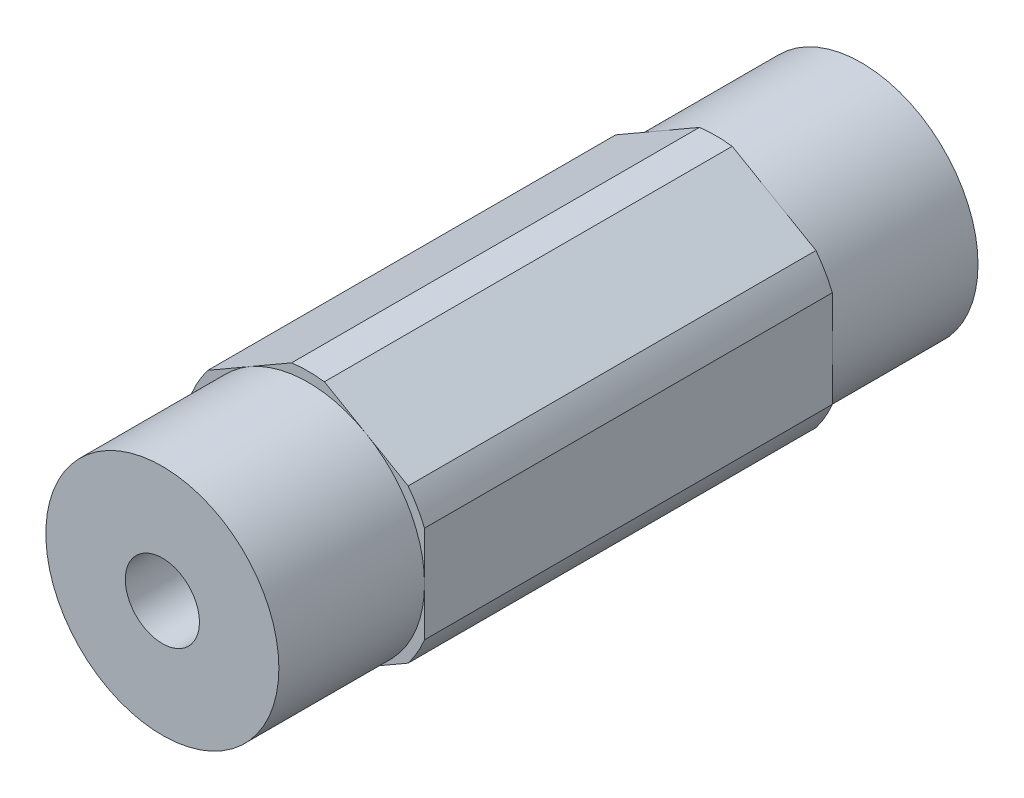
ISO-10303-21;
HEADER;
FILE_DESCRIPTION(('STEP AP214'),'2;1');
FILE_NAME('part.step','',(''),(''),'','','');
FILE_SCHEMA(('AUTOMOTIVE_DESIGN { 1 0 10303 214 1 1 1 1 }'));
ENDSEC;
DATA;
#1=APPLICATION_CONTEXT('core data for automotive mechanical design processes');
#2=APPLICATION_PROTOCOL_DEFINITION('international standard','automotive_design',2000,#1);
#3=PRODUCT_CONTEXT('',#1,'mechanical');
#4=PRODUCT('Part','Part','',(#3));
#5=PRODUCT_RELATED_PRODUCT_CATEGORY('part','',(#4));
#6=PRODUCT_DEFINITION_FORMATION('','',#4);
#7=PRODUCT_DEFINITION_CONTEXT('part definition',#1,'design');
#8=PRODUCT_DEFINITION('design','',#6,#7);
#9=PRODUCT_DEFINITION_SHAPE('','',#8);
#10=(LENGTH_UNIT() NAMED_UNIT(*) SI_UNIT(.MILLI.,.METRE.));
#11=(NAMED_UNIT(*) PLANE_ANGLE_UNIT() SI_UNIT($,.RADIAN.));
#12=(NAMED_UNIT(*) SI_UNIT($,.STERADIAN.) SOLID_ANGLE_UNIT());
#13=UNCERTAINTY_MEASURE_WITH_UNIT(LENGTH_MEASURE(1.E-05),#10,'distance_accuracy_value','');
#14=(GEOMETRIC_REPRESENTATION_CONTEXT(3) GLOBAL_UNCERTAINTY_ASSIGNED_CONTEXT((#13)) GLOBAL_UNIT_ASSIGNED_CONTEXT((#10,
#11,#12)) REPRESENTATION_CONTEXT('',''));
#15=CARTESIAN_POINT('',(0.,0.,0.));
#16=DIRECTION('',(0.,0.,1.));
#17=DIRECTION('',(1.,0.,0.));
#18=AXIS2_PLACEMENT_3D('',#15,#16,#17);
#19=CARTESIAN_POINT('',(6.34999999999999,0.,19.05));
#20=DIRECTION('',(-1.,0.,0.));
#21=DIRECTION('',(0.,-1.,0.));
#22=AXIS2_PLACEMENT_3D('',#19,#20,#21);
#23=PLANE('',#22);
#24=DIRECTION('',(0.,-1.,0.));
#25=VECTOR('',#24,1.);
#26=CARTESIAN_POINT('',(6.34999999999999,0.,-11.1125));
#27=LINE('',#26,#25);
#28=CARTESIAN_POINT('',(6.34999999999997,2.63498093588937,-11.1125));
#29=VERTEX_POINT('',#28);
#30=CARTESIAN_POINT('',(6.35,0.,-11.1125));
#31=VERTEX_POINT('',#30);
#32=EDGE_CURVE('E182',#29,#31,#27,.T.);
#33=ORIENTED_EDGE('',*,*,#32,.F.);
#34=DIRECTION('',(0.,0.,-1.));
#35=VECTOR('',#34,1.);
#36=CARTESIAN_POINT('',(6.34999999999997,2.63498093588937,19.05));
#37=LINE('',#36,#35);
#38=CARTESIAN_POINT('',(6.34999999999997,2.63498093588937,11.1125));
#39=VERTEX_POINT('',#38);
#40=EDGE_CURVE('E282',#39,#29,#37,.T.);
#41=ORIENTED_EDGE('',*,*,#40,.F.);
#42=DIRECTION('',(0.,1.,0.));
#43=VECTOR('',#42,1.);
#44=CARTESIAN_POINT('',(6.34999999999999,0.,11.1125));
#45=LINE('',#44,#43);
#46=CARTESIAN_POINT('',(6.35,0.,11.1125));
#47=VERTEX_POINT('',#46);
#48=EDGE_CURVE('E242',#47,#39,#45,.T.);
#49=ORIENTED_EDGE('',*,*,#48,.F.);
#50=CARTESIAN_POINT('',(6.35000000000002,-2.63498093588924,11.1125));
#51=VERTEX_POINT('',#50);
#52=EDGE_CURVE('E244',#51,#47,#45,.T.);
#53=ORIENTED_EDGE('',*,*,#52,.F.);
#54=DIRECTION('',(0.,0.,-1.));
#55=VECTOR('',#54,1.);
#56=CARTESIAN_POINT('',(6.35000000000002,-2.63498093588924,19.05));
#57=LINE('',#56,#55);
#58=CARTESIAN_POINT('',(6.35000000000002,-2.63498093588924,-11.1125));
#59=VERTEX_POINT('',#58);
#60=EDGE_CURVE('E214',#51,#59,#57,.T.);
#61=ORIENTED_EDGE('',*,*,#60,.T.);
#62=EDGE_CURVE('E70',#31,#59,#27,.T.);
#63=ORIENTED_EDGE('',*,*,#62,.F.);
#64=EDGE_LOOP('',(#33,#41,#49,#53,#61,#63));
#65=FACE_BOUND('',#64,.T.);
#66=ADVANCED_FACE('F55',(#65),#23,.F.);
#67=CARTESIAN_POINT('',(0.,0.,19.05));
#68=DIRECTION('',(0.,0.,-1.));
#69=DIRECTION('',(-1.,0.,0.));
#70=AXIS2_PLACEMENT_3D('',#67,#68,#69);
#71=CYLINDRICAL_SURFACE('',#70,6.874999966);
#72=CARTESIAN_POINT('',(0.,0.,-11.1125));
#73=DIRECTION('',(0.,0.,1.));
#74=DIRECTION('',(1.,0.,0.));
#75=AXIS2_PLACEMENT_3D('',#72,#73,#74);
#76=CIRCLE('',#75,6.874999966);
#77=CARTESIAN_POINT('',(5.45696042896776,4.18177084608661,-11.1125));
#78=VERTEX_POINT('',#77);
#79=EDGE_CURVE('E188',#29,#78,#76,.T.);
#80=ORIENTED_EDGE('',*,*,#79,.T.);
#81=DIRECTION('',(0.,0.,-1.));
#82=VECTOR('',#81,1.);
#83=CARTESIAN_POINT('',(5.45696042896777,4.18177084608661,19.05));
#84=LINE('',#83,#82);
#85=CARTESIAN_POINT('',(5.45696042896777,4.18177084608661,11.1125));
#86=VERTEX_POINT('',#85);
#87=EDGE_CURVE('E279',#86,#78,#84,.T.);
#88=ORIENTED_EDGE('',*,*,#87,.F.);
#89=CARTESIAN_POINT('',(0.,0.,11.1125));
#90=DIRECTION('',(0.,0.,1.));
#91=DIRECTION('',(1.,0.,0.));
#92=AXIS2_PLACEMENT_3D('',#89,#90,#91);
#93=CIRCLE('',#92,6.874999966);
#94=EDGE_CURVE('E225',#39,#86,#93,.T.);
#95=ORIENTED_EDGE('',*,*,#94,.F.);
#96=ORIENTED_EDGE('',*,*,#40,.T.);
#97=EDGE_LOOP('',(#80,#88,#95,#96));
#98=FACE_BOUND('',#97,.T.);
#99=ADVANCED_FACE('F308',(#98),#71,.T.);
#100=CARTESIAN_POINT('',(3.17499999999998,5.49926131403122,19.05));
#101=DIRECTION('',(-0.499999999999995,-0.866025403784442,0.));
#102=DIRECTION('',(0.866025403784442,-0.499999999999995,0.));
#103=AXIS2_PLACEMENT_3D('',#100,#101,#102);
#104=PLANE('',#103);
#105=DIRECTION('',(0.866025403784442,-0.499999999999995,0.));
#106=VECTOR('',#105,1.);
#107=CARTESIAN_POINT('',(3.17499999999998,5.49926131403122,-11.1125));
#108=LINE('',#107,#106);
#109=CARTESIAN_POINT('',(0.893039571032191,6.81675178197583,-11.1125));
#110=VERTEX_POINT('',#109);
#111=CARTESIAN_POINT('',(3.17499999999997,5.4992613140312,-11.1125));
#112=VERTEX_POINT('',#111);
#113=EDGE_CURVE('E215',#110,#112,#108,.T.);
#114=ORIENTED_EDGE('',*,*,#113,.F.);
#115=DIRECTION('',(0.,0.,-1.));
#116=VECTOR('',#115,1.);
#117=CARTESIAN_POINT('',(0.893039571032191,6.81675178197583,19.05));
#118=LINE('',#117,#116);
#119=CARTESIAN_POINT('',(0.893039571032191,6.81675178197583,11.1125));
#120=VERTEX_POINT('',#119);
#121=EDGE_CURVE('E276',#120,#110,#118,.T.);
#122=ORIENTED_EDGE('',*,*,#121,.F.);
#123=DIRECTION('',(-0.866025403784442,0.499999999999995,0.));
#124=VECTOR('',#123,1.);
#125=CARTESIAN_POINT('',(3.17499999999998,5.49926131403122,11.1125));
#126=LINE('',#125,#124);
#127=CARTESIAN_POINT('',(3.17499999999997,5.4992613140312,11.1125));
#128=VERTEX_POINT('',#127);
#129=EDGE_CURVE('E239',#128,#120,#126,.T.);
#130=ORIENTED_EDGE('',*,*,#129,.F.);
#131=EDGE_CURVE('E241',#86,#128,#126,.T.);
#132=ORIENTED_EDGE('',*,*,#131,.F.);
#133=ORIENTED_EDGE('',*,*,#87,.T.);
#134=EDGE_CURVE('E216',#112,#78,#108,.T.);
#135=ORIENTED_EDGE('',*,*,#134,.F.);
#136=EDGE_LOOP('',(#114,#122,#130,#132,#133,#135));
#137=FACE_BOUND('',#136,.T.);
#138=ADVANCED_FACE('F312',(#137),#104,.F.);
#139=CARTESIAN_POINT('',(-0.89303957103218,6.81675178197583,-11.1125));
#140=VERTEX_POINT('',#139);
#141=EDGE_CURVE('E379',#110,#140,#76,.T.);
#142=ORIENTED_EDGE('',*,*,#141,.T.);
#143=DIRECTION('',(0.,0.,-1.));
#144=VECTOR('',#143,1.);
#145=CARTESIAN_POINT('',(-0.893039571032176,6.81675178197583,19.05));
#146=LINE('',#145,#144);
#147=CARTESIAN_POINT('',(-0.893039571032173,6.81675178197583,11.1125));
#148=VERTEX_POINT('',#147);
#149=EDGE_CURVE('E273',#148,#140,#146,.T.);
#150=ORIENTED_EDGE('',*,*,#149,.F.);
#151=EDGE_CURVE('E227',#120,#148,#93,.T.);
#152=ORIENTED_EDGE('',*,*,#151,.F.);
#153=ORIENTED_EDGE('',*,*,#121,.T.);
#154=EDGE_LOOP('',(#142,#150,#152,#153));
#155=FACE_BOUND('',#154,.T.);
#156=ADVANCED_FACE('F321',(#155),#71,.T.);
#157=CARTESIAN_POINT('',(-3.175,5.49926131403118,19.05));
#158=DIRECTION('',(0.500000000000001,-0.866025403784438,0.));
#159=DIRECTION('',(0.866025403784438,0.500000000000001,0.));
#160=AXIS2_PLACEMENT_3D('',#157,#158,#159);
#161=PLANE('',#160);
#162=DIRECTION('',(0.866025403784438,0.500000000000001,0.));
#163=VECTOR('',#162,1.);
#164=CARTESIAN_POINT('',(-3.175,5.49926131403118,-11.1125));
#165=LINE('',#164,#163);
#166=CARTESIAN_POINT('',(-5.45696042896783,4.18177084608652,-11.1125));
#167=VERTEX_POINT('',#166);
#168=CARTESIAN_POINT('',(-3.17500000000001,5.49926131403118,-11.1125));
#169=VERTEX_POINT('',#168);
#170=EDGE_CURVE('E351',#167,#169,#165,.T.);
#171=ORIENTED_EDGE('',*,*,#170,.F.);
#172=DIRECTION('',(0.,0.,-1.));
#173=VECTOR('',#172,1.);
#174=CARTESIAN_POINT('',(-5.45696042896783,4.18177084608652,19.05));
#175=LINE('',#174,#173);
#176=CARTESIAN_POINT('',(-5.45696042896783,4.18177084608652,11.1125));
#177=VERTEX_POINT('',#176);
#178=EDGE_CURVE('E270',#177,#167,#175,.T.);
#179=ORIENTED_EDGE('',*,*,#178,.F.);
#180=DIRECTION('',(-0.866025403784438,-0.500000000000001,0.));
#181=VECTOR('',#180,1.);
#182=CARTESIAN_POINT('',(-3.175,5.49926131403118,11.1125));
#183=LINE('',#182,#181);
#184=CARTESIAN_POINT('',(-3.17500000000001,5.49926131403118,11.1125));
#185=VERTEX_POINT('',#184);
#186=EDGE_CURVE('E236',#185,#177,#183,.T.);
#187=ORIENTED_EDGE('',*,*,#186,.F.);
#188=EDGE_CURVE('E238',#148,#185,#183,.T.);
#189=ORIENTED_EDGE('',*,*,#188,.F.);
#190=ORIENTED_EDGE('',*,*,#149,.T.);
#191=EDGE_CURVE('E350',#169,#140,#165,.T.);
#192=ORIENTED_EDGE('',*,*,#191,.F.);
#193=EDGE_LOOP('',(#171,#179,#187,#189,#190,#192));
#194=FACE_BOUND('',#193,.T.);
#195=ADVANCED_FACE('F415',(#194),#161,.F.);
#196=CARTESIAN_POINT('',(-6.35,2.63498093588929,-11.1125));
#197=VERTEX_POINT('',#196);
#198=EDGE_CURVE('E378',#167,#197,#76,.T.);
#199=ORIENTED_EDGE('',*,*,#198,.T.);
#200=DIRECTION('',(0.,0.,-1.));
#201=VECTOR('',#200,1.);
#202=CARTESIAN_POINT('',(-6.35,2.63498093588928,19.05));
#203=LINE('',#202,#201);
#204=CARTESIAN_POINT('',(-6.35,2.63498093588928,11.1125));
#205=VERTEX_POINT('',#204);
#206=EDGE_CURVE('E267',#205,#197,#203,.T.);
#207=ORIENTED_EDGE('',*,*,#206,.F.);
#208=EDGE_CURVE('E322',#177,#205,#93,.T.);
#209=ORIENTED_EDGE('',*,*,#208,.F.);
#210=ORIENTED_EDGE('',*,*,#178,.T.);
#211=EDGE_LOOP('',(#199,#207,#209,#210));
#212=FACE_BOUND('',#211,.T.);
#213=ADVANCED_FACE('F376',(#212),#71,.T.);
#214=CARTESIAN_POINT('',(-6.34999999999999,0.,19.05));
#215=DIRECTION('',(1.,0.,0.));
#216=DIRECTION('',(0.,1.,0.));
#217=AXIS2_PLACEMENT_3D('',#214,#215,#216);
#218=PLANE('',#217);
#219=DIRECTION('',(0.,1.,0.));
#220=VECTOR('',#219,1.);
#221=CARTESIAN_POINT('',(-6.34999999999999,0.,-11.1125));
#222=LINE('',#221,#220);
#223=CARTESIAN_POINT('',(-6.34999999999999,-2.63498093588933,-11.1125));
#224=VERTEX_POINT('',#223);
#225=CARTESIAN_POINT('',(-6.35,0.,-11.1125));
#226=VERTEX_POINT('',#225);
#227=EDGE_CURVE('E349',#224,#226,#222,.T.);
#228=ORIENTED_EDGE('',*,*,#227,.F.);
#229=DIRECTION('',(0.,0.,-1.));
#230=VECTOR('',#229,1.);
#231=CARTESIAN_POINT('',(-6.34999999999999,-2.63498093588933,19.05));
#232=LINE('',#231,#230);
#233=CARTESIAN_POINT('',(-6.34999999999999,-2.63498093588933,11.1125));
#234=VERTEX_POINT('',#233);
#235=EDGE_CURVE('E264',#234,#224,#232,.T.);
#236=ORIENTED_EDGE('',*,*,#235,.F.);
#237=DIRECTION('',(0.,-1.,0.));
#238=VECTOR('',#237,1.);
#239=CARTESIAN_POINT('',(-6.34999999999999,0.,11.1125));
#240=LINE('',#239,#238);
#241=CARTESIAN_POINT('',(-6.35,0.,11.1125));
#242=VERTEX_POINT('',#241);
#243=EDGE_CURVE('E233',#242,#234,#240,.T.);
#244=ORIENTED_EDGE('',*,*,#243,.F.);
#245=EDGE_CURVE('E235',#205,#242,#240,.T.);
#246=ORIENTED_EDGE('',*,*,#245,.F.);
#247=ORIENTED_EDGE('',*,*,#206,.T.);
#248=EDGE_CURVE('E348',#226,#197,#222,.T.);
#249=ORIENTED_EDGE('',*,*,#248,.F.);
#250=EDGE_LOOP('',(#228,#236,#244,#246,#247,#249));
#251=FACE_BOUND('',#250,.T.);
#252=ADVANCED_FACE('F372',(#251),#218,.F.);
#253=CARTESIAN_POINT('',(-5.4569604289678,-4.18177084608656,-11.1125));
#254=VERTEX_POINT('',#253);
#255=EDGE_CURVE('E362',#224,#254,#76,.T.);
#256=ORIENTED_EDGE('',*,*,#255,.T.);
#257=DIRECTION('',(0.,0.,-1.));
#258=VECTOR('',#257,1.);
#259=CARTESIAN_POINT('',(-5.4569604289678,-4.18177084608656,19.05));
#260=LINE('',#259,#258);
#261=CARTESIAN_POINT('',(-5.4569604289678,-4.18177084608656,11.1125));
#262=VERTEX_POINT('',#261);
#263=EDGE_CURVE('E261',#262,#254,#260,.T.);
#264=ORIENTED_EDGE('',*,*,#263,.F.);
#265=EDGE_CURVE('E323',#234,#262,#93,.T.);
#266=ORIENTED_EDGE('',*,*,#265,.F.);
#267=ORIENTED_EDGE('',*,*,#235,.T.);
#268=EDGE_LOOP('',(#256,#264,#266,#267));
#269=FACE_BOUND('',#268,.T.);
#270=ADVANCED_FACE('F421',(#269),#71,.T.);
#271=CARTESIAN_POINT('',(-3.17499999999996,-5.4992613140312,19.05));
#272=DIRECTION('',(0.499999999999995,0.866025403784442,0.));
#273=DIRECTION('',(-0.866025403784442,0.499999999999995,0.));
#274=AXIS2_PLACEMENT_3D('',#271,#272,#273);
#275=PLANE('',#274);
#276=DIRECTION('',(-0.866025403784442,0.499999999999995,0.));
#277=VECTOR('',#276,1.);
#278=CARTESIAN_POINT('',(-3.17499999999996,-5.4992613140312,-11.1125));
#279=LINE('',#278,#277);
#280=CARTESIAN_POINT('',(-0.893039571032124,-6.81675178197584,-11.1125));
#281=VERTEX_POINT('',#280);
#282=CARTESIAN_POINT('',(-3.17499999999997,-5.4992613140312,-11.1125));
#283=VERTEX_POINT('',#282);
#284=EDGE_CURVE('E344',#281,#283,#279,.T.);
#285=ORIENTED_EDGE('',*,*,#284,.F.);
#286=DIRECTION('',(0.,0.,-1.));
#287=VECTOR('',#286,1.);
#288=CARTESIAN_POINT('',(-0.893039571032124,-6.81675178197584,19.05));
#289=LINE('',#288,#287);
#290=CARTESIAN_POINT('',(-0.893039571032124,-6.81675178197584,11.1125));
#291=VERTEX_POINT('',#290);
#292=EDGE_CURVE('E258',#291,#281,#289,.T.);
#293=ORIENTED_EDGE('',*,*,#292,.F.);
#294=DIRECTION('',(0.866025403784442,-0.499999999999995,0.));
#295=VECTOR('',#294,1.);
#296=CARTESIAN_POINT('',(-3.17499999999996,-5.4992613140312,11.1125));
#297=LINE('',#296,#295);
#298=CARTESIAN_POINT('',(-3.17499999999997,-5.4992613140312,11.1125));
#299=VERTEX_POINT('',#298);
#300=EDGE_CURVE('E230',#299,#291,#297,.T.);
#301=ORIENTED_EDGE('',*,*,#300,.F.);
#302=EDGE_CURVE('E232',#262,#299,#297,.T.);
#303=ORIENTED_EDGE('',*,*,#302,.F.);
#304=ORIENTED_EDGE('',*,*,#263,.T.);
#305=EDGE_CURVE('E342',#283,#254,#279,.T.);
#306=ORIENTED_EDGE('',*,*,#305,.F.);
#307=EDGE_LOOP('',(#285,#293,#301,#303,#304,#306));
#308=FACE_BOUND('',#307,.T.);
#309=ADVANCED_FACE('F397',(#308),#275,.F.);
#310=CARTESIAN_POINT('',(0.893039571032216,-6.81675178197583,-11.1125));
#311=VERTEX_POINT('',#310);
#312=EDGE_CURVE('E380',#281,#311,#76,.T.);
#313=ORIENTED_EDGE('',*,*,#312,.T.);
#314=DIRECTION('',(0.,0.,-1.));
#315=VECTOR('',#314,1.);
#316=CARTESIAN_POINT('',(0.893039571032224,-6.81675178197583,19.05));
#317=LINE('',#316,#315);
#318=CARTESIAN_POINT('',(0.893039571032224,-6.81675178197583,11.1125));
#319=VERTEX_POINT('',#318);
#320=EDGE_CURVE('E255',#319,#311,#317,.T.);
#321=ORIENTED_EDGE('',*,*,#320,.F.);
#322=EDGE_CURVE('E327',#291,#319,#93,.T.);
#323=ORIENTED_EDGE('',*,*,#322,.F.);
#324=ORIENTED_EDGE('',*,*,#292,.T.);
#325=EDGE_LOOP('',(#313,#321,#323,#324));
#326=FACE_BOUND('',#325,.T.);
#327=ADVANCED_FACE('F386',(#326),#71,.T.);
#328=CARTESIAN_POINT('',(3.17500000000004,-5.49926131403116,19.05));
#329=DIRECTION('',(-0.500000000000007,0.866025403784434,0.));
#330=DIRECTION('',(-0.866025403784435,-0.500000000000007,0.));
#331=AXIS2_PLACEMENT_3D('',#328,#329,#330);
#332=PLANE('',#331);
#333=DIRECTION('',(-0.866025403784435,-0.500000000000007,0.));
#334=VECTOR('',#333,1.);
#335=CARTESIAN_POINT('',(3.17500000000004,-5.49926131403116,-11.1125));
#336=LINE('',#335,#334);
#337=CARTESIAN_POINT('',(5.45696042896786,-4.18177084608649,-11.1125));
#338=VERTEX_POINT('',#337);
#339=CARTESIAN_POINT('',(3.17500000000004,-5.49926131403116,-11.1125));
#340=VERTEX_POINT('',#339);
#341=EDGE_CURVE('E198',#338,#340,#336,.T.);
#342=ORIENTED_EDGE('',*,*,#341,.F.);
#343=DIRECTION('',(0.,0.,-1.));
#344=VECTOR('',#343,1.);
#345=CARTESIAN_POINT('',(5.45696042896786,-4.18177084608649,19.05));
#346=LINE('',#345,#344);
#347=CARTESIAN_POINT('',(5.45696042896786,-4.18177084608649,11.1125));
#348=VERTEX_POINT('',#347);
#349=EDGE_CURVE('E252',#348,#338,#346,.T.);
#350=ORIENTED_EDGE('',*,*,#349,.F.);
#351=DIRECTION('',(0.866025403784435,0.500000000000007,0.));
#352=VECTOR('',#351,1.);
#353=CARTESIAN_POINT('',(3.17500000000004,-5.49926131403116,11.1125));
#354=LINE('',#353,#352);
#355=CARTESIAN_POINT('',(3.17500000000004,-5.49926131403116,11.1125));
#356=VERTEX_POINT('',#355);
#357=EDGE_CURVE('E78',#356,#348,#354,.T.);
#358=ORIENTED_EDGE('',*,*,#357,.F.);
#359=EDGE_CURVE('E229',#319,#356,#354,.T.);
#360=ORIENTED_EDGE('',*,*,#359,.F.);
#361=ORIENTED_EDGE('',*,*,#320,.T.);
#362=EDGE_CURVE('E341',#340,#311,#336,.T.);
#363=ORIENTED_EDGE('',*,*,#362,.F.);
#364=EDGE_LOOP('',(#342,#350,#358,#360,#361,#363));
#365=FACE_BOUND('',#364,.T.);
#366=ADVANCED_FACE('F339',(#365),#332,.F.);
#367=EDGE_CURVE('E210',#338,#59,#76,.T.);
#368=ORIENTED_EDGE('',*,*,#367,.T.);
#369=ORIENTED_EDGE('',*,*,#60,.F.);
#370=EDGE_CURVE('E223',#348,#51,#93,.T.);
#371=ORIENTED_EDGE('',*,*,#370,.F.);
#372=ORIENTED_EDGE('',*,*,#349,.T.);
#373=EDGE_LOOP('',(#368,#369,#371,#372));
#374=FACE_BOUND('',#373,.T.);
#375=ADVANCED_FACE('F337',(#374),#71,.T.);
#376=CARTESIAN_POINT('',(0.,0.,-19.05));
#377=DIRECTION('',(0.,0.,1.));
#378=DIRECTION('',(1.,0.,0.));
#379=AXIS2_PLACEMENT_3D('',#376,#377,#378);
#380=PLANE('',#379);
#381=CARTESIAN_POINT('',(0.,0.,-19.05));
#382=DIRECTION('',(0.,0.,1.));
#383=DIRECTION('',(1.,0.,0.));
#384=AXIS2_PLACEMENT_3D('',#381,#382,#383);
#385=CIRCLE('',#384,2.0193);
#386=CARTESIAN_POINT('',(-2.0193,0.,-19.05));
#387=VERTEX_POINT('',#386);
#388=EDGE_CURVE('E248',#387,#387,#385,.T.);
#389=ORIENTED_EDGE('',*,*,#388,.T.);
#390=EDGE_LOOP('',(#389));
#391=FACE_BOUND('',#390,.T.);
#392=CARTESIAN_POINT('',(0.,0.,-19.05));
#393=DIRECTION('',(0.,0.,1.));
#394=DIRECTION('',(1.,0.,0.));
#395=AXIS2_PLACEMENT_3D('',#392,#393,#394);
#396=CIRCLE('',#395,6.35);
#397=CARTESIAN_POINT('',(6.35,0.,-19.05));
#398=VERTEX_POINT('',#397);
#399=EDGE_CURVE('E11',#398,#398,#396,.F.);
#400=ORIENTED_EDGE('',*,*,#399,.T.);
#401=EDGE_LOOP('',(#400));
#402=FACE_BOUND('',#401,.T.);
#403=ADVANCED_FACE('F426',(#391,#402),#380,.F.);
#404=CARTESIAN_POINT('',(0.,0.,19.05));
#405=DIRECTION('',(0.,0.,1.));
#406=DIRECTION('',(1.,0.,0.));
#407=AXIS2_PLACEMENT_3D('',#404,#405,#406);
#408=PLANE('',#407);
#409=CARTESIAN_POINT('',(0.,0.,19.05));
#410=DIRECTION('',(0.,0.,1.));
#411=DIRECTION('',(1.,0.,0.));
#412=AXIS2_PLACEMENT_3D('',#409,#410,#411);
#413=CIRCLE('',#412,2.0193);
#414=CARTESIAN_POINT('',(-2.0193,0.,19.05));
#415=VERTEX_POINT('',#414);
#416=EDGE_CURVE('E245',#415,#415,#413,.T.);
#417=ORIENTED_EDGE('',*,*,#416,.F.);
#418=EDGE_LOOP('',(#417));
#419=FACE_BOUND('',#418,.T.);
#420=CARTESIAN_POINT('',(0.,0.,19.05));
#421=DIRECTION('',(0.,0.,1.));
#422=DIRECTION('',(1.,0.,0.));
#423=AXIS2_PLACEMENT_3D('',#420,#421,#422);
#424=CIRCLE('',#423,6.35);
#425=CARTESIAN_POINT('',(6.35,0.,19.05));
#426=VERTEX_POINT('',#425);
#427=EDGE_CURVE('E63',#426,#426,#424,.T.);
#428=ORIENTED_EDGE('',*,*,#427,.T.);
#429=EDGE_LOOP('',(#428));
#430=FACE_BOUND('',#429,.T.);
#431=ADVANCED_FACE('F286',(#419,#430),#408,.T.);
#432=CARTESIAN_POINT('',(0.,0.,19.05));
#433=DIRECTION('',(0.,0.,-1.));
#434=DIRECTION('',(-1.,0.,0.));
#435=AXIS2_PLACEMENT_3D('',#432,#433,#434);
#436=CYLINDRICAL_SURFACE('',#435,2.0193);
#437=CARTESIAN_POINT('',(-2.0193,0.,-19.05));
#438=CARTESIAN_POINT('',(-2.0193,0.,-18.653125));
#439=CARTESIAN_POINT('',(-2.0193,0.,-18.25625));
#440=CARTESIAN_POINT('',(-2.0193,0.,-17.4625));
#441=CARTESIAN_POINT('',(-2.0193,0.,-17.065625));
#442=CARTESIAN_POINT('',(-2.0193,0.,-16.271875));
#443=CARTESIAN_POINT('',(-2.0193,0.,-15.875));
#444=CARTESIAN_POINT('',(-2.0193,0.,-15.08125));
#445=CARTESIAN_POINT('',(-2.0193,0.,-14.684375));
#446=CARTESIAN_POINT('',(-2.0193,0.,-13.890625));
#447=CARTESIAN_POINT('',(-2.0193,0.,-13.49375));
#448=CARTESIAN_POINT('',(-2.0193,0.,-12.7));
#449=CARTESIAN_POINT('',(-2.0193,0.,-12.303125));
#450=CARTESIAN_POINT('',(-2.0193,0.,-11.509375));
#451=CARTESIAN_POINT('',(-2.0193,0.,-11.1125));
#452=CARTESIAN_POINT('',(-2.0193,0.,-10.31875));
#453=CARTESIAN_POINT('',(-2.0193,0.,-9.921875));
#454=CARTESIAN_POINT('',(-2.0193,0.,-9.128125));
#455=CARTESIAN_POINT('',(-2.0193,0.,-8.73125));
#456=CARTESIAN_POINT('',(-2.0193,0.,-7.9375));
#457=CARTESIAN_POINT('',(-2.0193,0.,-7.540625));
#458=CARTESIAN_POINT('',(-2.0193,0.,-6.746875));
#459=CARTESIAN_POINT('',(-2.0193,0.,-6.35));
#460=CARTESIAN_POINT('',(-2.0193,0.,-5.55625));
#461=CARTESIAN_POINT('',(-2.0193,0.,-5.159375));
#462=CARTESIAN_POINT('',(-2.0193,0.,-4.365625));
#463=CARTESIAN_POINT('',(-2.0193,0.,-3.96875));
#464=CARTESIAN_POINT('',(-2.0193,0.,-3.175));
#465=CARTESIAN_POINT('',(-2.0193,0.,-2.778125));
#466=CARTESIAN_POINT('',(-2.0193,0.,-1.984375));
#467=CARTESIAN_POINT('',(-2.0193,0.,-1.5875));
#468=CARTESIAN_POINT('',(-2.0193,0.,-0.79375));
#469=CARTESIAN_POINT('',(-2.0193,0.,-0.396875));
#470=CARTESIAN_POINT('',(-2.0193,0.,0.396875));
#471=CARTESIAN_POINT('',(-2.0193,0.,0.79375));
#472=CARTESIAN_POINT('',(-2.0193,0.,1.5875));
#473=CARTESIAN_POINT('',(-2.0193,0.,1.984375));
#474=CARTESIAN_POINT('',(-2.0193,0.,2.778125));
#475=CARTESIAN_POINT('',(-2.0193,0.,3.175));
#476=CARTESIAN_POINT('',(-2.0193,0.,3.96875));
#477=CARTESIAN_POINT('',(-2.0193,0.,4.365625));
#478=CARTESIAN_POINT('',(-2.0193,0.,5.159375));
#479=CARTESIAN_POINT('',(-2.0193,0.,5.55625));
#480=CARTESIAN_POINT('',(-2.0193,0.,6.35));
#481=CARTESIAN_POINT('',(-2.0193,0.,6.746875));
#482=CARTESIAN_POINT('',(-2.0193,0.,7.540625));
#483=CARTESIAN_POINT('',(-2.0193,0.,7.9375));
#484=CARTESIAN_POINT('',(-2.0193,0.,8.73125));
#485=CARTESIAN_POINT('',(-2.0193,0.,9.128125));
#486=CARTESIAN_POINT('',(-2.0193,0.,9.921875));
#487=CARTESIAN_POINT('',(-2.0193,0.,10.31875));
#488=CARTESIAN_POINT('',(-2.0193,0.,11.1125));
#489=CARTESIAN_POINT('',(-2.0193,0.,11.509375));
#490=CARTESIAN_POINT('',(-2.0193,0.,12.303125));
#491=CARTESIAN_POINT('',(-2.0193,0.,12.7));
#492=CARTESIAN_POINT('',(-2.0193,0.,13.49375));
#493=CARTESIAN_POINT('',(-2.0193,0.,13.890625));
#494=CARTESIAN_POINT('',(-2.0193,0.,14.684375));
#495=CARTESIAN_POINT('',(-2.0193,0.,15.08125));
#496=CARTESIAN_POINT('',(-2.0193,0.,15.875));
#497=CARTESIAN_POINT('',(-2.0193,0.,16.271875));
#498=CARTESIAN_POINT('',(-2.0193,0.,17.065625));
#499=CARTESIAN_POINT('',(-2.0193,0.,17.4625));
#500=CARTESIAN_POINT('',(-2.0193,0.,18.25625));
#501=CARTESIAN_POINT('',(-2.0193,0.,18.653125));
#502=CARTESIAN_POINT('',(-2.0193,0.,19.05));
#503=B_SPLINE_CURVE_WITH_KNOTS('',3,(#437,#438,#439,#440,#441,#442,#443,#444,#445,#446,#447,
#448,#449,#450,#451,#452,#453,#454,#455,#456,#457,#458,#459,#460,#461,#462,#463,#464,#465,#466,
#467,#468,#469,#470,#471,#472,#473,#474,#475,#476,#477,#478,#479,#480,#481,#482,#483,#484,#485,
#486,#487,#488,#489,#490,#491,#492,#493,#494,#495,#496,#497,#498,#499,#500,#501,#502),
.UNSPECIFIED.,.F.,.F.,(4,2,2,2,2,2,2,2,2,2,2,2,2,2,2,2,2,2,2,2,2,2,2,2,2,2,2,2,2,2,2,2,4),(0.,
1.190625,2.38125,3.571875,4.7625,5.953125,7.14375,8.334375,9.525,10.715625,11.90625,13.096875,
14.2875,15.478125,16.66875,17.859375,19.05,20.240625,21.43125,22.621875,23.8125,25.003125,
26.19375,27.384375,28.575,29.765625,30.95625,32.146875,33.3375,34.528125,35.71875,36.909375,
38.1),.UNSPECIFIED.);
#504=EDGE_CURVE('BSEAM57',#387,#415,#503,.T.);
#505=ORIENTED_EDGE('',*,*,#388,.F.);
#506=ORIENTED_EDGE('',*,*,#416,.T.);
#507=ORIENTED_EDGE('',*,*,#504,.T.);
#508=ORIENTED_EDGE('',*,*,#504,.F.);
#509=EDGE_LOOP('',(#505,#507,#506,#508));
#510=FACE_BOUND('',#509,.T.);
#511=ADVANCED_FACE('F57',(#510),#436,.F.);
#512=CARTESIAN_POINT('',(0.,0.,11.1125));
#513=DIRECTION('',(0.,0.,1.));
#514=DIRECTION('',(1.,0.,0.));
#515=AXIS2_PLACEMENT_3D('',#512,#513,#514);
#516=PLANE('',#515);
#517=ORIENTED_EDGE('',*,*,#52,.T.);
#518=CARTESIAN_POINT('',(0.,0.,11.1125));
#519=DIRECTION('',(0.,0.,1.));
#520=DIRECTION('',(1.,0.,0.));
#521=AXIS2_PLACEMENT_3D('',#518,#519,#520);
#522=CIRCLE('',#521,6.35);
#523=EDGE_CURVE('E192',#356,#47,#522,.T.);
#524=ORIENTED_EDGE('',*,*,#523,.F.);
#525=ORIENTED_EDGE('',*,*,#357,.T.);
#526=ORIENTED_EDGE('',*,*,#370,.T.);
#527=EDGE_LOOP('',(#517,#524,#525,#526));
#528=FACE_BOUND('',#527,.T.);
#529=ADVANCED_FACE('F334',(#528),#516,.T.);
#530=ORIENTED_EDGE('',*,*,#48,.T.);
#531=ORIENTED_EDGE('',*,*,#94,.T.);
#532=ORIENTED_EDGE('',*,*,#131,.T.);
#533=EDGE_CURVE('E220',#47,#128,#522,.T.);
#534=ORIENTED_EDGE('',*,*,#533,.F.);
#535=EDGE_LOOP('',(#530,#531,#532,#534));
#536=FACE_BOUND('',#535,.T.);
#537=ADVANCED_FACE('F303',(#536),#516,.T.);
#538=ORIENTED_EDGE('',*,*,#129,.T.);
#539=ORIENTED_EDGE('',*,*,#151,.T.);
#540=ORIENTED_EDGE('',*,*,#188,.T.);
#541=EDGE_CURVE('E224',#128,#185,#522,.T.);
#542=ORIENTED_EDGE('',*,*,#541,.F.);
#543=EDGE_LOOP('',(#538,#539,#540,#542));
#544=FACE_BOUND('',#543,.T.);
#545=ADVANCED_FACE('F316',(#544),#516,.T.);
#546=ORIENTED_EDGE('',*,*,#186,.T.);
#547=ORIENTED_EDGE('',*,*,#208,.T.);
#548=ORIENTED_EDGE('',*,*,#245,.T.);
#549=EDGE_CURVE('E395',#185,#242,#522,.T.);
#550=ORIENTED_EDGE('',*,*,#549,.F.);
#551=EDGE_LOOP('',(#546,#547,#548,#550));
#552=FACE_BOUND('',#551,.T.);
#553=ADVANCED_FACE('F444',(#552),#516,.T.);
#554=ORIENTED_EDGE('',*,*,#243,.T.);
#555=ORIENTED_EDGE('',*,*,#265,.T.);
#556=ORIENTED_EDGE('',*,*,#302,.T.);
#557=EDGE_CURVE('E391',#242,#299,#522,.T.);
#558=ORIENTED_EDGE('',*,*,#557,.F.);
#559=EDGE_LOOP('',(#554,#555,#556,#558));
#560=FACE_BOUND('',#559,.T.);
#561=ADVANCED_FACE('F440',(#560),#516,.T.);
#562=ORIENTED_EDGE('',*,*,#300,.T.);
#563=ORIENTED_EDGE('',*,*,#322,.T.);
#564=ORIENTED_EDGE('',*,*,#359,.T.);
#565=EDGE_CURVE('E300',#299,#356,#522,.T.);
#566=ORIENTED_EDGE('',*,*,#565,.F.);
#567=EDGE_LOOP('',(#562,#563,#564,#566));
#568=FACE_BOUND('',#567,.T.);
#569=ADVANCED_FACE('F291',(#568),#516,.T.);
#570=CARTESIAN_POINT('',(0.,0.,11.1125));
#571=DIRECTION('',(0.,0.,1.));
#572=DIRECTION('',(1.,0.,0.));
#573=AXIS2_PLACEMENT_3D('',#570,#571,#572);
#574=CYLINDRICAL_SURFACE('',#573,6.35);
#575=ORIENTED_EDGE('',*,*,#427,.F.);
#576=EDGE_LOOP('',(#575));
#577=FACE_BOUND('',#576,.T.);
#578=ORIENTED_EDGE('',*,*,#523,.T.);
#579=ORIENTED_EDGE('',*,*,#533,.T.);
#580=ORIENTED_EDGE('',*,*,#541,.T.);
#581=ORIENTED_EDGE('',*,*,#549,.T.);
#582=ORIENTED_EDGE('',*,*,#557,.T.);
#583=ORIENTED_EDGE('',*,*,#565,.T.);
#584=EDGE_LOOP('',(#578,#579,#580,#581,#582,#583));
#585=FACE_BOUND('',#584,.T.);
#586=ADVANCED_FACE('F288',(#577,#585),#574,.T.);
#587=CARTESIAN_POINT('',(0.,0.,-11.1125));
#588=DIRECTION('',(0.,0.,-1.));
#589=DIRECTION('',(1.,0.,0.));
#590=AXIS2_PLACEMENT_3D('',#587,#588,#589);
#591=PLANE('',#590);
#592=ORIENTED_EDGE('',*,*,#32,.T.);
#593=CARTESIAN_POINT('',(0.,0.,-11.1125));
#594=DIRECTION('',(0.,0.,1.));
#595=DIRECTION('',(1.,0.,0.));
#596=AXIS2_PLACEMENT_3D('',#593,#594,#595);
#597=CIRCLE('',#596,6.35);
#598=EDGE_CURVE('E185',#31,#112,#597,.T.);
#599=ORIENTED_EDGE('',*,*,#598,.T.);
#600=ORIENTED_EDGE('',*,*,#134,.T.);
#601=ORIENTED_EDGE('',*,*,#79,.F.);
#602=EDGE_LOOP('',(#592,#599,#600,#601));
#603=FACE_BOUND('',#602,.T.);
#604=ADVANCED_FACE('F183',(#603),#591,.T.);
#605=ORIENTED_EDGE('',*,*,#62,.T.);
#606=ORIENTED_EDGE('',*,*,#367,.F.);
#607=ORIENTED_EDGE('',*,*,#341,.T.);
#608=EDGE_CURVE('E195',#340,#31,#597,.T.);
#609=ORIENTED_EDGE('',*,*,#608,.T.);
#610=EDGE_LOOP('',(#605,#606,#607,#609));
#611=FACE_BOUND('',#610,.T.);
#612=ADVANCED_FACE('F196',(#611),#591,.T.);
#613=ORIENTED_EDGE('',*,*,#113,.T.);
#614=EDGE_CURVE('E209',#112,#169,#597,.T.);
#615=ORIENTED_EDGE('',*,*,#614,.T.);
#616=ORIENTED_EDGE('',*,*,#191,.T.);
#617=ORIENTED_EDGE('',*,*,#141,.F.);
#618=EDGE_LOOP('',(#613,#615,#616,#617));
#619=FACE_BOUND('',#618,.T.);
#620=ADVANCED_FACE('F590',(#619),#591,.T.);
#621=ORIENTED_EDGE('',*,*,#170,.T.);
#622=EDGE_CURVE('E367',#169,#226,#597,.T.);
#623=ORIENTED_EDGE('',*,*,#622,.T.);
#624=ORIENTED_EDGE('',*,*,#248,.T.);
#625=ORIENTED_EDGE('',*,*,#198,.F.);
#626=EDGE_LOOP('',(#621,#623,#624,#625));
#627=FACE_BOUND('',#626,.T.);
#628=ADVANCED_FACE('F369',(#627),#591,.T.);
#629=ORIENTED_EDGE('',*,*,#227,.T.);
#630=EDGE_CURVE('E359',#226,#283,#597,.T.);
#631=ORIENTED_EDGE('',*,*,#630,.T.);
#632=ORIENTED_EDGE('',*,*,#305,.T.);
#633=ORIENTED_EDGE('',*,*,#255,.F.);
#634=EDGE_LOOP('',(#629,#631,#632,#633));
#635=FACE_BOUND('',#634,.T.);
#636=ADVANCED_FACE('F358',(#635),#591,.T.);
#637=ORIENTED_EDGE('',*,*,#284,.T.);
#638=EDGE_CURVE('E202',#283,#340,#597,.T.);
#639=ORIENTED_EDGE('',*,*,#638,.T.);
#640=ORIENTED_EDGE('',*,*,#362,.T.);
#641=ORIENTED_EDGE('',*,*,#312,.F.);
#642=EDGE_LOOP('',(#637,#639,#640,#641));
#643=FACE_BOUND('',#642,.T.);
#644=ADVANCED_FACE('F398',(#643),#591,.T.);
#645=CARTESIAN_POINT('',(0.,0.,-11.1125));
#646=DIRECTION('',(0.,0.,-1.));
#647=DIRECTION('',(-1.,0.,0.));
#648=AXIS2_PLACEMENT_3D('',#645,#646,#647);
#649=CYLINDRICAL_SURFACE('',#648,6.35);
#650=ORIENTED_EDGE('',*,*,#598,.F.);
#651=ORIENTED_EDGE('',*,*,#608,.F.);
#652=ORIENTED_EDGE('',*,*,#638,.F.);
#653=ORIENTED_EDGE('',*,*,#630,.F.);
#654=ORIENTED_EDGE('',*,*,#622,.F.);
#655=ORIENTED_EDGE('',*,*,#614,.F.);
#656=EDGE_LOOP('',(#650,#651,#652,#653,#654,#655));
#657=FACE_BOUND('',#656,.T.);
#658=ORIENTED_EDGE('',*,*,#399,.F.);
#659=EDGE_LOOP('',(#658));
#660=FACE_BOUND('',#659,.T.);
#661=ADVANCED_FACE('F205',(#657,#660),#649,.T.);
#662=CLOSED_SHELL('',(#66,#99,#138,#156,#195,#213,#252,#270,#309,#327,#366,#375,#403,#431,#511,
#529,#537,#545,#553,#561,#569,#586,#604,#612,#620,#628,#636,#644,#661));
#663=MANIFOLD_SOLID_BREP('B2',#662);
#664=ADVANCED_BREP_SHAPE_REPRESENTATION('',(#18,#663),#14);
#665=SHAPE_DEFINITION_REPRESENTATION(#9,#664);
ENDSEC;
END-ISO-10303-21;
